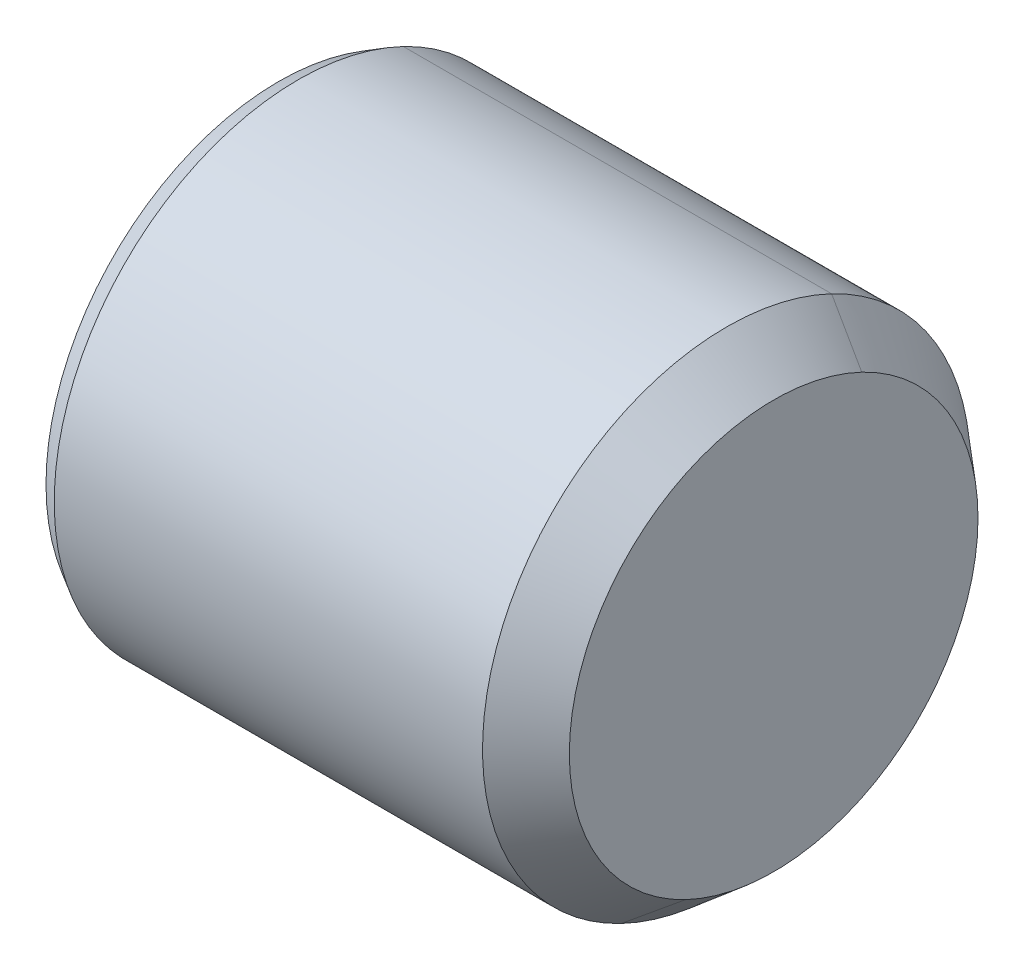
ISO-10303-21;
HEADER;
FILE_DESCRIPTION(('STEP AP214'),'2;1');
FILE_NAME('part.step','',(''),(''),'','','');
FILE_SCHEMA(('AUTOMOTIVE_DESIGN { 1 0 10303 214 1 1 1 1 }'));
ENDSEC;
DATA;
#1=APPLICATION_CONTEXT('core data for automotive mechanical design processes');
#2=APPLICATION_PROTOCOL_DEFINITION('international standard','automotive_design',2000,#1);
#3=PRODUCT_CONTEXT('',#1,'mechanical');
#4=PRODUCT('Part','Part','',(#3));
#5=PRODUCT_RELATED_PRODUCT_CATEGORY('part','',(#4));
#6=PRODUCT_DEFINITION_FORMATION('','',#4);
#7=PRODUCT_DEFINITION_CONTEXT('part definition',#1,'design');
#8=PRODUCT_DEFINITION('design','',#6,#7);
#9=PRODUCT_DEFINITION_SHAPE('','',#8);
#10=(LENGTH_UNIT() NAMED_UNIT(*) SI_UNIT(.MILLI.,.METRE.));
#11=(NAMED_UNIT(*) PLANE_ANGLE_UNIT() SI_UNIT($,.RADIAN.));
#12=(NAMED_UNIT(*) SI_UNIT($,.STERADIAN.) SOLID_ANGLE_UNIT());
#13=UNCERTAINTY_MEASURE_WITH_UNIT(LENGTH_MEASURE(1.E-05),#10,'distance_accuracy_value','');
#14=(GEOMETRIC_REPRESENTATION_CONTEXT(3) GLOBAL_UNCERTAINTY_ASSIGNED_CONTEXT((#13)) GLOBAL_UNIT_ASSIGNED_CONTEXT((#10,
#11,#12)) REPRESENTATION_CONTEXT('',''));
#15=CARTESIAN_POINT('',(0.,0.,0.));
#16=DIRECTION('',(0.,0.,1.));
#17=DIRECTION('',(1.,0.,0.));
#18=AXIS2_PLACEMENT_3D('',#15,#16,#17);
#19=CARTESIAN_POINT('',(-12.319,0.178135327362643,4.86595566807278));
#20=DIRECTION('',(-1.,0.,0.));
#21=DIRECTION('',(0.,0.942878117034373,0.333137893998438));
#22=AXIS2_PLACEMENT_3D('',#19,#20,#21);
#23=PLANE('',#22);
#24=DIRECTION('',(0.,0.0777516815222871,-0.996972755906829));
#25=VECTOR('',#24,1.);
#26=CARTESIAN_POINT('',(-12.319,-2.06719468151497,8.13790245641583));
#27=LINE('',#26,#25);
#28=CARTESIAN_POINT('',(-12.319,-2.06719468417151,8.13790245647881));
#29=VERTEX_POINT('',#28);
#30=CARTESIAN_POINT('',(-12.319,-1.88905935973355,5.85375812405334));
#31=VERTEX_POINT('',#30);
#32=EDGE_CURVE('E140',#29,#31,#27,.T.);
#33=ORIENTED_EDGE('',*,*,#32,.F.);
#34=DIRECTION('',(0.,-0.824527892613182,-0.565821309516409));
#35=VECTOR('',#34,1.);
#36=CARTESIAN_POINT('',(-12.319,-0.178135330530213,9.43424433654306));
#37=LINE('',#36,#35);
#38=CARTESIAN_POINT('',(-12.319,-0.178135329256498,9.43424433421095));
#39=VERTEX_POINT('',#38);
#40=EDGE_CURVE('E24',#39,#29,#37,.T.);
#41=ORIENTED_EDGE('',*,*,#40,.F.);
#42=DIRECTION('',(0.,-0.902279574303909,0.431151446470908));
#43=VECTOR('',#42,1.);
#44=CARTESIAN_POINT('',(-12.319,1.88905935973357,8.44644187594664));
#45=LINE('',#44,#43);
#46=CARTESIAN_POINT('',(-12.319,1.88905935973355,8.44644187594664));
#47=VERTEX_POINT('',#46);
#48=EDGE_CURVE('E11',#47,#39,#45,.T.);
#49=ORIENTED_EDGE('',*,*,#48,.F.);
#50=DIRECTION('',(0.,-0.0777516815222871,0.996972755906829));
#51=VECTOR('',#50,1.);
#52=CARTESIAN_POINT('',(-12.319,2.06719468151497,6.16229754358417));
#53=LINE('',#52,#51);
#54=CARTESIAN_POINT('',(-12.319,2.0671946841715,6.16229754352118));
#55=VERTEX_POINT('',#54);
#56=EDGE_CURVE('E125',#55,#47,#53,.T.);
#57=ORIENTED_EDGE('',*,*,#56,.F.);
#58=DIRECTION('',(0.,0.824527892613183,0.565821309516409));
#59=VECTOR('',#58,1.);
#60=CARTESIAN_POINT('',(-12.319,0.178135330530213,4.86595566345694));
#61=LINE('',#60,#59);
#62=CARTESIAN_POINT('',(-12.319,0.178135329256497,4.86595566578905));
#63=VERTEX_POINT('',#62);
#64=EDGE_CURVE('E131',#63,#55,#61,.T.);
#65=ORIENTED_EDGE('',*,*,#64,.F.);
#66=DIRECTION('',(0.,0.902279574303909,-0.431151446470908));
#67=VECTOR('',#66,1.);
#68=CARTESIAN_POINT('',(-12.319,-1.88905935973355,5.85375812405335));
#69=LINE('',#68,#67);
#70=EDGE_CURVE('E136',#31,#63,#69,.T.);
#71=ORIENTED_EDGE('',*,*,#70,.F.);
#72=EDGE_LOOP('',(#33,#41,#49,#57,#65,#71));
#73=FACE_BOUND('',#72,.T.);
#74=ADVANCED_FACE('F17',(#73),#23,.T.);
#75=CARTESIAN_POINT('',(-12.319,-0.178135327362643,9.43424433192722));
#76=DIRECTION('',(0.,0.431151446470908,0.902279574303909));
#77=DIRECTION('',(0.707106781186548,0.638008005516405,-0.304870111517968));
#78=AXIS2_PLACEMENT_3D('',#75,#76,#77);
#79=PLANE('',#78);
#80=ORIENTED_EDGE('',*,*,#48,.T.);
#81=DIRECTION('',(-1.,0.,0.));
#82=VECTOR('',#81,1.);
#83=CARTESIAN_POINT('',(-12.319,-0.178135328820773,9.43424433262398));
#84=LINE('',#83,#82);
#85=CARTESIAN_POINT('',(-15.875,-0.178135329256497,9.43424433421095));
#86=VERTEX_POINT('',#85);
#87=EDGE_CURVE('E143',#39,#86,#84,.T.);
#88=ORIENTED_EDGE('',*,*,#87,.T.);
#89=DIRECTION('',(0.,-0.902279574128325,0.431151446838357));
#90=VECTOR('',#89,1.);
#91=CARTESIAN_POINT('',(-15.875,1.88905935973356,8.44644187594663));
#92=LINE('',#91,#90);
#93=CARTESIAN_POINT('',(-15.875,1.88905935973355,8.44644187594664));
#94=VERTEX_POINT('',#93);
#95=EDGE_CURVE('E113',#94,#86,#92,.T.);
#96=ORIENTED_EDGE('',*,*,#95,.F.);
#97=DIRECTION('',(-1.,0.,0.));
#98=VECTOR('',#97,1.);
#99=CARTESIAN_POINT('',(-12.319,1.88905935973354,8.44644187594665));
#100=LINE('',#99,#98);
#101=EDGE_CURVE('E122',#47,#94,#100,.T.);
#102=ORIENTED_EDGE('',*,*,#101,.F.);
#103=EDGE_LOOP('',(#80,#88,#96,#102));
#104=FACE_BOUND('',#103,.T.);
#105=ADVANCED_FACE('F149',(#104),#79,.F.);
#106=CARTESIAN_POINT('',(-12.319,-2.06719468709621,8.13790245598057));
#107=DIRECTION('',(0.,-0.565821309516409,0.824527892613183));
#108=DIRECTION('',(-0.343723769041782,0.774290069135984,0.531346270743575));
#109=AXIS2_PLACEMENT_3D('',#106,#107,#108);
#110=PLANE('',#109);
#111=ORIENTED_EDGE('',*,*,#40,.T.);
#112=DIRECTION('',(-1.,0.,0.));
#113=VECTOR('',#112,1.);
#114=CARTESIAN_POINT('',(-12.319,-2.06719468576374,8.13790245689496));
#115=LINE('',#114,#113);
#116=CARTESIAN_POINT('',(-15.875,-2.0671946841715,8.13790245647882));
#117=VERTEX_POINT('',#116);
#118=EDGE_CURVE('E139',#29,#117,#115,.T.);
#119=ORIENTED_EDGE('',*,*,#118,.T.);
#120=DIRECTION('',(0.,-0.824527893304465,-0.565821308509056));
#121=VECTOR('',#120,1.);
#122=CARTESIAN_POINT('',(-15.875,-0.178135328418493,9.43424433346582));
#123=LINE('',#122,#121);
#124=EDGE_CURVE('E154',#86,#117,#123,.T.);
#125=ORIENTED_EDGE('',*,*,#124,.F.);
#126=ORIENTED_EDGE('',*,*,#87,.F.);
#127=EDGE_LOOP('',(#111,#119,#125,#126));
#128=FACE_BOUND('',#127,.T.);
#129=ADVANCED_FACE('F155',(#128),#110,.F.);
#130=CARTESIAN_POINT('',(-12.319,-1.88905935973354,5.85375812405335));
#131=DIRECTION('',(0.,-0.996972755906829,-0.077751681522287));
#132=DIRECTION('',(-0.806898221328125,-0.045927179214824,0.588902330294997));
#133=AXIS2_PLACEMENT_3D('',#130,#131,#132);
#134=PLANE('',#133);
#135=ORIENTED_EDGE('',*,*,#32,.T.);
#136=DIRECTION('',(-1.,0.,0.));
#137=VECTOR('',#136,1.);
#138=CARTESIAN_POINT('',(-12.319,-1.88905935973355,5.85375812405335));
#139=LINE('',#138,#137);
#140=CARTESIAN_POINT('',(-15.875,-1.88905935973355,5.85375812405336));
#141=VERTEX_POINT('',#140);
#142=EDGE_CURVE('E134',#31,#141,#139,.T.);
#143=ORIENTED_EDGE('',*,*,#142,.T.);
#144=DIRECTION('',(0.,0.0777516831463252,-0.996972755780174));
#145=VECTOR('',#144,1.);
#146=CARTESIAN_POINT('',(-15.875,-2.06719468523579,8.13790245612566));
#147=LINE('',#146,#145);
#148=EDGE_CURVE('E160',#117,#141,#147,.T.);
#149=ORIENTED_EDGE('',*,*,#148,.F.);
#150=ORIENTED_EDGE('',*,*,#118,.F.);
#151=EDGE_LOOP('',(#135,#143,#149,#150));
#152=FACE_BOUND('',#151,.T.);
#153=ADVANCED_FACE('F177',(#152),#134,.F.);
#154=CARTESIAN_POINT('',(-12.319,0.178135327362643,4.86595566807278));
#155=DIRECTION('',(0.,-0.431151446470908,-0.902279574303909));
#156=DIRECTION('',(-0.707106781186548,-0.638008005516405,0.304870111517968));
#157=AXIS2_PLACEMENT_3D('',#154,#155,#156);
#158=PLANE('',#157);
#159=ORIENTED_EDGE('',*,*,#70,.T.);
#160=DIRECTION('',(1.,0.,0.));
#161=VECTOR('',#160,1.);
#162=CARTESIAN_POINT('',(-15.875,0.178135330530222,4.86595566345695));
#163=LINE('',#162,#161);
#164=CARTESIAN_POINT('',(-15.875,0.178135329256497,4.86595566578905));
#165=VERTEX_POINT('',#164);
#166=EDGE_CURVE('E128',#165,#63,#163,.T.);
#167=ORIENTED_EDGE('',*,*,#166,.F.);
#168=DIRECTION('',(0.,0.902279574128325,-0.431151446838357));
#169=VECTOR('',#168,1.);
#170=CARTESIAN_POINT('',(-15.875,-1.88905935973356,5.85375812405336));
#171=LINE('',#170,#169);
#172=EDGE_CURVE('E170',#141,#165,#171,.T.);
#173=ORIENTED_EDGE('',*,*,#172,.F.);
#174=ORIENTED_EDGE('',*,*,#142,.F.);
#175=EDGE_LOOP('',(#159,#167,#173,#174));
#176=FACE_BOUND('',#175,.T.);
#177=ADVANCED_FACE('F180',(#176),#158,.F.);
#178=CARTESIAN_POINT('',(-12.319,2.06719468709621,6.16229754401943));
#179=DIRECTION('',(0.,0.565821309516409,-0.824527892613183));
#180=DIRECTION('',(0.343723769041782,-0.774290069135984,-0.531346270743575));
#181=AXIS2_PLACEMENT_3D('',#178,#179,#180);
#182=PLANE('',#181);
#183=ORIENTED_EDGE('',*,*,#64,.T.);
#184=DIRECTION('',(-1.,0.,0.));
#185=VECTOR('',#184,1.);
#186=CARTESIAN_POINT('',(-12.319,2.06719468151497,6.16229754358417));
#187=LINE('',#186,#185);
#188=CARTESIAN_POINT('',(-15.875,2.0671946841715,6.16229754352118));
#189=VERTEX_POINT('',#188);
#190=EDGE_CURVE('E120',#55,#189,#187,.T.);
#191=ORIENTED_EDGE('',*,*,#190,.T.);
#192=DIRECTION('',(0.,0.824527893304465,0.565821308509056));
#193=VECTOR('',#192,1.);
#194=CARTESIAN_POINT('',(-15.875,0.178135328418493,4.86595566653418));
#195=LINE('',#194,#193);
#196=EDGE_CURVE('E166',#165,#189,#195,.T.);
#197=ORIENTED_EDGE('',*,*,#196,.F.);
#198=ORIENTED_EDGE('',*,*,#166,.T.);
#199=EDGE_LOOP('',(#183,#191,#197,#198));
#200=FACE_BOUND('',#199,.T.);
#201=ADVANCED_FACE('F182',(#200),#182,.F.);
#202=CARTESIAN_POINT('',(-12.319,1.88905935973354,8.44644187594665));
#203=DIRECTION('',(0.,0.996972755906829,0.077751681522287));
#204=DIRECTION('',(0.806898221328125,0.045927179214824,-0.588902330294997));
#205=AXIS2_PLACEMENT_3D('',#202,#203,#204);
#206=PLANE('',#205);
#207=ORIENTED_EDGE('',*,*,#56,.T.);
#208=ORIENTED_EDGE('',*,*,#101,.T.);
#209=DIRECTION('',(0.,-0.0777516831463252,0.996972755780174));
#210=VECTOR('',#209,1.);
#211=CARTESIAN_POINT('',(-15.875,2.06719468523579,6.16229754387434));
#212=LINE('',#211,#210);
#213=EDGE_CURVE('E100',#189,#94,#212,.T.);
#214=ORIENTED_EDGE('',*,*,#213,.F.);
#215=ORIENTED_EDGE('',*,*,#190,.F.);
#216=EDGE_LOOP('',(#207,#208,#214,#215));
#217=FACE_BOUND('',#216,.T.);
#218=ADVANCED_FACE('F183',(#217),#206,.F.);
#219=CARTESIAN_POINT('',(-15.9397579706738,0.,7.1501));
#220=DIRECTION('',(1.,0.,0.));
#221=DIRECTION('',(0.,-0.902279574303909,0.431151446470908));
#222=AXIS2_PLACEMENT_3D('',#219,#220,#221);
#223=CONICAL_SURFACE('',#222,2.94755441455949,0.523598732049674);
#224=CARTESIAN_POINT('',(-15.625000004,0.,7.1501));
#225=DIRECTION('',(-1.,0.,0.));
#226=DIRECTION('',(0.,0.902279574303909,-0.431151446470908));
#227=AXIS2_PLACEMENT_3D('',#224,#225,#226);
#228=CIRCLE('',#227,3.12927999307181);
#229=CARTESIAN_POINT('',(-15.625000005,2.82348542315216,5.80090640308106));
#230=VERTEX_POINT('',#229);
#231=CARTESIAN_POINT('',(-15.625000005,-2.82348542315216,8.49929359691893));
#232=VERTEX_POINT('',#231);
#233=EDGE_CURVE('E116',#230,#232,#228,.T.);
#234=ORIENTED_EDGE('',*,*,#233,.T.);
#235=DIRECTION('',(-0.866025425558754,0.451139753123185,-0.215575706974908));
#236=VECTOR('',#235,1.);
#237=CARTESIAN_POINT('',(-15.625000004,-2.82348542002658,8.49929359542538));
#238=LINE('',#237,#236);
#239=CARTESIAN_POINT('',(-15.875,-2.6932525964308,8.4370622517594));
#240=VERTEX_POINT('',#239);
#241=EDGE_CURVE('E97',#232,#240,#238,.T.);
#242=ORIENTED_EDGE('',*,*,#241,.T.);
#243=CARTESIAN_POINT('',(-15.875,0.,7.1501));
#244=DIRECTION('',(-1.,0.,0.));
#245=DIRECTION('',(0.,0.902279574303909,-0.431151446470908));
#246=AXIS2_PLACEMENT_3D('',#243,#244,#245);
#247=CIRCLE('',#246,2.98494244260001);
#248=CARTESIAN_POINT('',(-15.875,2.6932525964308,5.8631377482406));
#249=VERTEX_POINT('',#248);
#250=EDGE_CURVE('E90',#249,#240,#247,.T.);
#251=ORIENTED_EDGE('',*,*,#250,.F.);
#252=DIRECTION('',(0.866025425558753,0.451139753123185,-0.215575706974914));
#253=VECTOR('',#252,1.);
#254=CARTESIAN_POINT('',(-15.875,2.6932525964308,5.8631377482406));
#255=LINE('',#254,#253);
#256=EDGE_CURVE('E94',#249,#230,#255,.T.);
#257=ORIENTED_EDGE('',*,*,#256,.T.);
#258=EDGE_LOOP('',(#234,#242,#251,#257));
#259=FACE_BOUND('',#258,.T.);
#260=ADVANCED_FACE('F92',(#259),#223,.T.);
#261=CARTESIAN_POINT('',(-15.875,0.,7.1501));
#262=DIRECTION('',(-1.,0.,0.));
#263=DIRECTION('',(0.,0.942878117034373,0.333137893998438));
#264=AXIS2_PLACEMENT_3D('',#261,#262,#263);
#265=PLANE('',#264);
#266=ORIENTED_EDGE('',*,*,#95,.T.);
#267=ORIENTED_EDGE('',*,*,#124,.T.);
#268=ORIENTED_EDGE('',*,*,#148,.T.);
#269=ORIENTED_EDGE('',*,*,#172,.T.);
#270=ORIENTED_EDGE('',*,*,#196,.T.);
#271=ORIENTED_EDGE('',*,*,#213,.T.);
#272=EDGE_LOOP('',(#266,#267,#268,#269,#270,#271));
#273=FACE_BOUND('',#272,.T.);
#274=CARTESIAN_POINT('',(-15.875,0.,7.1501));
#275=DIRECTION('',(-1.,0.,0.));
#276=DIRECTION('',(0.,-0.902279574303909,0.431151446470908));
#277=AXIS2_PLACEMENT_3D('',#274,#275,#276);
#278=CIRCLE('',#277,2.98494244260001);
#279=EDGE_CURVE('E102',#240,#249,#278,.T.);
#280=ORIENTED_EDGE('',*,*,#279,.T.);
#281=ORIENTED_EDGE('',*,*,#250,.T.);
#282=EDGE_LOOP('',(#280,#281));
#283=FACE_BOUND('',#282,.T.);
#284=ADVANCED_FACE('F103',(#273,#283),#265,.T.);
#285=CARTESIAN_POINT('',(-15.9397579706738,0.,7.1501));
#286=DIRECTION('',(1.,0.,0.));
#287=DIRECTION('',(0.,-0.902279574303909,0.431151446470908));
#288=AXIS2_PLACEMENT_3D('',#285,#286,#287);
#289=CONICAL_SURFACE('',#288,2.94755441455949,0.523598732049674);
#290=ORIENTED_EDGE('',*,*,#241,.F.);
#291=CARTESIAN_POINT('',(-15.625000004,0.,7.1501));
#292=DIRECTION('',(-1.,0.,0.));
#293=DIRECTION('',(0.,-0.902279574303909,0.431151446470909));
#294=AXIS2_PLACEMENT_3D('',#291,#292,#293);
#295=CIRCLE('',#294,3.12927999307181);
#296=EDGE_CURVE('E108',#232,#230,#295,.T.);
#297=ORIENTED_EDGE('',*,*,#296,.T.);
#298=ORIENTED_EDGE('',*,*,#256,.F.);
#299=ORIENTED_EDGE('',*,*,#279,.F.);
#300=EDGE_LOOP('',(#290,#297,#298,#299));
#301=FACE_BOUND('',#300,.T.);
#302=ADVANCED_FACE('F106',(#301),#289,.T.);
#303=CARTESIAN_POINT('',(-9.46771821329302,0.,7.1501));
#304=DIRECTION('',(-1.,0.,0.));
#305=DIRECTION('',(0.,0.902279574303909,-0.431151446470908));
#306=AXIS2_PLACEMENT_3D('',#303,#304,#305);
#307=CONICAL_SURFACE('',#306,2.57321487419968,0.698131697737837);
#308=CARTESIAN_POINT('',(-10.1304108288,0.,7.1501));
#309=DIRECTION('',(1.,0.,0.));
#310=DIRECTION('',(0.,-0.902279574303909,0.431151446470909));
#311=AXIS2_PLACEMENT_3D('',#308,#309,#310);
#312=CIRCLE('',#311,3.12928);
#313=CARTESIAN_POINT('',(-10.1304108288,-2.82348542627773,8.49929359841248));
#314=VERTEX_POINT('',#313);
#315=CARTESIAN_POINT('',(-10.1304108288,2.82348542627773,5.80090640158752));
#316=VERTEX_POINT('',#315);
#317=EDGE_CURVE('E246',#314,#316,#312,.T.);
#318=ORIENTED_EDGE('',*,*,#317,.T.);
#319=DIRECTION('',(0.766044445085842,-0.57997412872084,0.277138806679302));
#320=VECTOR('',#319,1.);
#321=CARTESIAN_POINT('',(-10.1304108288,2.82348542627773,5.80090640158752));
#322=LINE('',#321,#320);
#323=CARTESIAN_POINT('',(-9.525,2.36512740253135,6.01993133639474));
#324=VERTEX_POINT('',#323);
#325=EDGE_CURVE('E31',#316,#324,#322,.T.);
#326=ORIENTED_EDGE('',*,*,#325,.T.);
#327=CARTESIAN_POINT('',(-9.525,0.,7.1501));
#328=DIRECTION('',(1.,0.,0.));
#329=DIRECTION('',(0.,-0.902279574303909,0.431151446470908));
#330=AXIS2_PLACEMENT_3D('',#327,#328,#329);
#331=CIRCLE('',#330,2.62128);
#332=CARTESIAN_POINT('',(-9.525,-2.36512740253135,8.28026866360526));
#333=VERTEX_POINT('',#332);
#334=EDGE_CURVE('E35',#333,#324,#331,.T.);
#335=ORIENTED_EDGE('',*,*,#334,.F.);
#336=DIRECTION('',(-0.766044445085841,-0.57997412872084,0.277138806679303));
#337=VECTOR('',#336,1.);
#338=CARTESIAN_POINT('',(-9.525,-2.36512740253135,8.28026866360526));
#339=LINE('',#338,#337);
#340=EDGE_CURVE('E237',#333,#314,#339,.T.);
#341=ORIENTED_EDGE('',*,*,#340,.T.);
#342=EDGE_LOOP('',(#318,#326,#335,#341));
#343=FACE_BOUND('',#342,.T.);
#344=ADVANCED_FACE('F209',(#343),#307,.T.);
#345=CARTESIAN_POINT('',(-9.525,0.,7.1501));
#346=DIRECTION('',(-1.,0.,0.));
#347=DIRECTION('',(0.,0.942878117034373,0.333137893998438));
#348=AXIS2_PLACEMENT_3D('',#345,#346,#347);
#349=PLANE('',#348);
#350=CARTESIAN_POINT('',(-9.525,0.,7.1501));
#351=DIRECTION('',(1.,0.,0.));
#352=DIRECTION('',(0.,0.902279574303909,-0.431151446470908));
#353=AXIS2_PLACEMENT_3D('',#350,#351,#352);
#354=CIRCLE('',#353,2.62128);
#355=EDGE_CURVE('E236',#324,#333,#354,.T.);
#356=ORIENTED_EDGE('',*,*,#355,.T.);
#357=ORIENTED_EDGE('',*,*,#334,.T.);
#358=EDGE_LOOP('',(#356,#357));
#359=FACE_BOUND('',#358,.T.);
#360=ADVANCED_FACE('F212',(#359),#349,.F.);
#361=CARTESIAN_POINT('',(-9.46771821329302,0.,7.1501));
#362=DIRECTION('',(-1.,0.,0.));
#363=DIRECTION('',(0.,0.902279574303909,-0.431151446470908));
#364=AXIS2_PLACEMENT_3D('',#361,#362,#363);
#365=CONICAL_SURFACE('',#364,2.57321487419968,0.698131697737837);
#366=ORIENTED_EDGE('',*,*,#325,.F.);
#367=CARTESIAN_POINT('',(-10.1304108288,0.,7.1501));
#368=DIRECTION('',(1.,0.,0.));
#369=DIRECTION('',(0.,0.902279574303909,-0.431151446470908));
#370=AXIS2_PLACEMENT_3D('',#367,#368,#369);
#371=CIRCLE('',#370,3.12928);
#372=EDGE_CURVE('E118',#316,#314,#371,.T.);
#373=ORIENTED_EDGE('',*,*,#372,.T.);
#374=ORIENTED_EDGE('',*,*,#340,.F.);
#375=ORIENTED_EDGE('',*,*,#355,.F.);
#376=EDGE_LOOP('',(#366,#373,#374,#375));
#377=FACE_BOUND('',#376,.T.);
#378=ADVANCED_FACE('F215',(#377),#365,.T.);
#379=CARTESIAN_POINT('',(-15.624999992,0.,7.1501));
#380=DIRECTION('',(-1.,0.,0.));
#381=DIRECTION('',(0.,0.902279574303909,-0.431151446470908));
#382=AXIS2_PLACEMENT_3D('',#379,#380,#381);
#383=CYLINDRICAL_SURFACE('',#382,3.12928);
#384=DIRECTION('',(-1.,0.,0.));
#385=VECTOR('',#384,1.);
#386=CARTESIAN_POINT('',(-10.1304108288,2.82348542627774,5.80090640158752));
#387=LINE('',#386,#385);
#388=EDGE_CURVE('E119',#316,#230,#387,.T.);
#389=ORIENTED_EDGE('',*,*,#388,.T.);
#390=ORIENTED_EDGE('',*,*,#296,.F.);
#391=DIRECTION('',(1.,0.,0.));
#392=VECTOR('',#391,1.);
#393=CARTESIAN_POINT('',(-15.625000004,-2.82348542627774,8.49929359841248));
#394=LINE('',#393,#392);
#395=EDGE_CURVE('E234',#232,#314,#394,.T.);
#396=ORIENTED_EDGE('',*,*,#395,.T.);
#397=ORIENTED_EDGE('',*,*,#372,.F.);
#398=EDGE_LOOP('',(#389,#390,#396,#397));
#399=FACE_BOUND('',#398,.T.);
#400=ADVANCED_FACE('F219',(#399),#383,.T.);
#401=CARTESIAN_POINT('',(-15.624999992,0.,7.1501));
#402=DIRECTION('',(-1.,0.,0.));
#403=DIRECTION('',(0.,0.902279574303909,-0.431151446470908));
#404=AXIS2_PLACEMENT_3D('',#401,#402,#403);
#405=CYLINDRICAL_SURFACE('',#404,3.12928);
#406=ORIENTED_EDGE('',*,*,#233,.F.);
#407=ORIENTED_EDGE('',*,*,#388,.F.);
#408=ORIENTED_EDGE('',*,*,#317,.F.);
#409=ORIENTED_EDGE('',*,*,#395,.F.);
#410=EDGE_LOOP('',(#406,#407,#408,#409));
#411=FACE_BOUND('',#410,.T.);
#412=ADVANCED_FACE('F223',(#411),#405,.T.);
#413=CLOSED_SHELL('',(#74,#105,#129,#153,#177,#201,#218,#260,#284,#302,#344,#360,#378,#400,#412));
#414=MANIFOLD_SOLID_BREP('B1',#413);
#415=ADVANCED_BREP_SHAPE_REPRESENTATION('',(#18,#414),#14);
#416=SHAPE_DEFINITION_REPRESENTATION(#9,#415);
ENDSEC;
END-ISO-10303-21;
